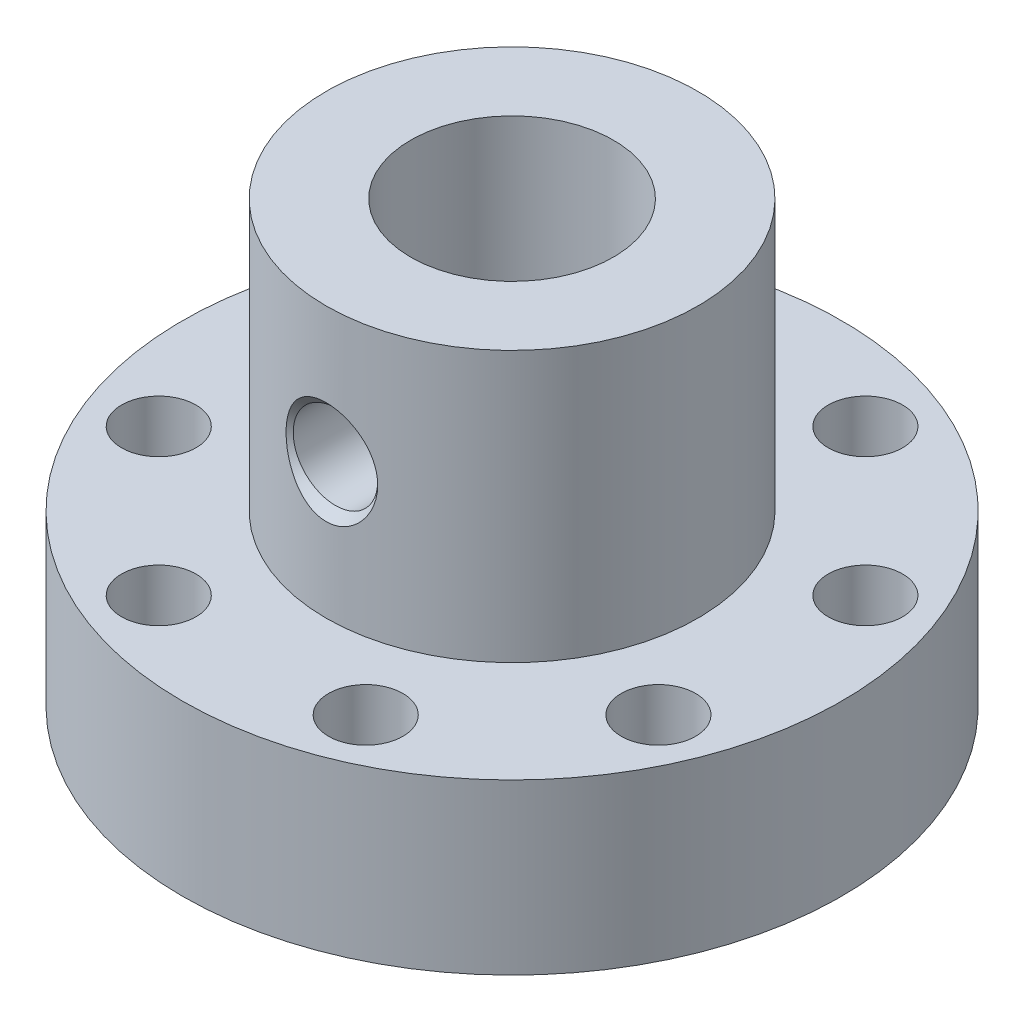
ISO-10303-21;
HEADER;
FILE_DESCRIPTION(('STEP AP214'),'2;1');
FILE_NAME('part.step','',(''),(''),'','','');
FILE_SCHEMA(('AUTOMOTIVE_DESIGN { 1 0 10303 214 1 1 1 1 }'));
ENDSEC;
DATA;
#1=APPLICATION_CONTEXT('core data for automotive mechanical design processes');
#2=APPLICATION_PROTOCOL_DEFINITION('international standard','automotive_design',2000,#1);
#3=PRODUCT_CONTEXT('',#1,'mechanical');
#4=PRODUCT('Part','Part','',(#3));
#5=PRODUCT_RELATED_PRODUCT_CATEGORY('part','',(#4));
#6=PRODUCT_DEFINITION_FORMATION('','',#4);
#7=PRODUCT_DEFINITION_CONTEXT('part definition',#1,'design');
#8=PRODUCT_DEFINITION('design','',#6,#7);
#9=PRODUCT_DEFINITION_SHAPE('','',#8);
#10=(LENGTH_UNIT() NAMED_UNIT(*) SI_UNIT(.MILLI.,.METRE.));
#11=(NAMED_UNIT(*) PLANE_ANGLE_UNIT() SI_UNIT($,.RADIAN.));
#12=(NAMED_UNIT(*) SI_UNIT($,.STERADIAN.) SOLID_ANGLE_UNIT());
#13=UNCERTAINTY_MEASURE_WITH_UNIT(LENGTH_MEASURE(1.E-05),#10,'distance_accuracy_value','');
#14=(GEOMETRIC_REPRESENTATION_CONTEXT(3) GLOBAL_UNCERTAINTY_ASSIGNED_CONTEXT((#13)) GLOBAL_UNIT_ASSIGNED_CONTEXT((#10,
#11,#12)) REPRESENTATION_CONTEXT('',''));
#15=CARTESIAN_POINT('',(0.,0.,0.));
#16=DIRECTION('',(0.,0.,1.));
#17=DIRECTION('',(1.,0.,0.));
#18=AXIS2_PLACEMENT_3D('',#15,#16,#17);
#19=CARTESIAN_POINT('',(0.,0.,0.));
#20=DIRECTION('',(0.,1.,0.));
#21=DIRECTION('',(0.,0.,1.));
#22=AXIS2_PLACEMENT_3D('',#19,#20,#21);
#23=PLANE('',#22);
#24=CARTESIAN_POINT('',(-3.06146745892072,0.,7.39103626009029));
#25=DIRECTION('',(0.,1.,0.));
#26=DIRECTION('',(0.,0.,1.));
#27=AXIS2_PLACEMENT_3D('',#24,#25,#26);
#28=CIRCLE('',#27,1.1);
#29=CARTESIAN_POINT('',(-3.06146745892072,0.,8.4910362600903));
#30=VERTEX_POINT('',#29);
#31=EDGE_CURVE('E250',#30,#30,#28,.T.);
#32=ORIENTED_EDGE('',*,*,#31,.T.);
#33=EDGE_LOOP('',(#32));
#34=FACE_BOUND('',#33,.T.);
#35=CARTESIAN_POINT('',(3.06146745892072,0.,-7.39103626009029));
#36=DIRECTION('',(0.,1.,0.));
#37=DIRECTION('',(0.,0.,1.));
#38=AXIS2_PLACEMENT_3D('',#35,#36,#37);
#39=CIRCLE('',#38,1.1);
#40=CARTESIAN_POINT('',(3.06146745892072,0.,-6.29103626009029));
#41=VERTEX_POINT('',#40);
#42=EDGE_CURVE('E255',#41,#41,#39,.T.);
#43=ORIENTED_EDGE('',*,*,#42,.T.);
#44=EDGE_LOOP('',(#43));
#45=FACE_BOUND('',#44,.T.);
#46=CARTESIAN_POINT('',(3.06146745892072,0.,7.39103626009029));
#47=DIRECTION('',(0.,1.,0.));
#48=DIRECTION('',(0.,0.,1.));
#49=AXIS2_PLACEMENT_3D('',#46,#47,#48);
#50=CIRCLE('',#49,1.1);
#51=CARTESIAN_POINT('',(3.06146745892072,0.,8.4910362600903));
#52=VERTEX_POINT('',#51);
#53=EDGE_CURVE('E241',#52,#52,#50,.T.);
#54=ORIENTED_EDGE('',*,*,#53,.T.);
#55=EDGE_LOOP('',(#54));
#56=FACE_BOUND('',#55,.T.);
#57=CARTESIAN_POINT('',(7.39103626009029,0.,3.06146745892072));
#58=DIRECTION('',(0.,1.,0.));
#59=DIRECTION('',(0.,0.,1.));
#60=AXIS2_PLACEMENT_3D('',#57,#58,#59);
#61=CIRCLE('',#60,1.1);
#62=CARTESIAN_POINT('',(7.39103626009029,0.,4.16146745892072));
#63=VERTEX_POINT('',#62);
#64=EDGE_CURVE('E238',#63,#63,#61,.T.);
#65=ORIENTED_EDGE('',*,*,#64,.T.);
#66=EDGE_LOOP('',(#65));
#67=FACE_BOUND('',#66,.T.);
#68=CARTESIAN_POINT('',(-7.39103626009029,0.,3.06146745892072));
#69=DIRECTION('',(0.,1.,0.));
#70=DIRECTION('',(0.,0.,1.));
#71=AXIS2_PLACEMENT_3D('',#68,#69,#70);
#72=CIRCLE('',#71,1.1);
#73=CARTESIAN_POINT('',(-7.39103626009029,0.,4.16146745892072));
#74=VERTEX_POINT('',#73);
#75=EDGE_CURVE('E273',#74,#74,#72,.T.);
#76=ORIENTED_EDGE('',*,*,#75,.T.);
#77=EDGE_LOOP('',(#76));
#78=FACE_BOUND('',#77,.T.);
#79=CARTESIAN_POINT('',(-7.3910362600903,0.,-3.06146745892072));
#80=DIRECTION('',(0.,1.,0.));
#81=DIRECTION('',(0.,0.,1.));
#82=AXIS2_PLACEMENT_3D('',#79,#80,#81);
#83=CIRCLE('',#82,1.1);
#84=CARTESIAN_POINT('',(-7.3910362600903,0.,-1.96146745892072));
#85=VERTEX_POINT('',#84);
#86=EDGE_CURVE('E267',#85,#85,#83,.T.);
#87=ORIENTED_EDGE('',*,*,#86,.T.);
#88=EDGE_LOOP('',(#87));
#89=FACE_BOUND('',#88,.T.);
#90=CARTESIAN_POINT('',(-3.06146745892072,0.,-7.39103626009029));
#91=DIRECTION('',(0.,1.,0.));
#92=DIRECTION('',(0.,0.,1.));
#93=AXIS2_PLACEMENT_3D('',#90,#91,#92);
#94=CIRCLE('',#93,1.1);
#95=CARTESIAN_POINT('',(-3.06146745892072,0.,-6.2910362600903));
#96=VERTEX_POINT('',#95);
#97=EDGE_CURVE('E261',#96,#96,#94,.T.);
#98=ORIENTED_EDGE('',*,*,#97,.T.);
#99=EDGE_LOOP('',(#98));
#100=FACE_BOUND('',#99,.T.);
#101=CARTESIAN_POINT('',(7.3910362600903,0.,-3.06146745892072));
#102=DIRECTION('',(0.,1.,0.));
#103=DIRECTION('',(0.,0.,1.));
#104=AXIS2_PLACEMENT_3D('',#101,#102,#103);
#105=CIRCLE('',#104,1.1);
#106=CARTESIAN_POINT('',(7.3910362600903,0.,-1.96146745892072));
#107=VERTEX_POINT('',#106);
#108=EDGE_CURVE('E233',#107,#107,#105,.T.);
#109=ORIENTED_EDGE('',*,*,#108,.T.);
#110=EDGE_LOOP('',(#109));
#111=FACE_BOUND('',#110,.T.);
#112=CARTESIAN_POINT('',(0.,0.,0.));
#113=DIRECTION('',(0.,1.,0.));
#114=DIRECTION('',(0.,0.,1.));
#115=AXIS2_PLACEMENT_3D('',#112,#113,#114);
#116=CIRCLE('',#115,9.75);
#117=CARTESIAN_POINT('',(0.,0.,9.75));
#118=VERTEX_POINT('',#117);
#119=EDGE_CURVE('E58',#118,#118,#116,.T.);
#120=ORIENTED_EDGE('',*,*,#119,.F.);
#121=EDGE_LOOP('',(#120));
#122=FACE_BOUND('',#121,.T.);
#123=CARTESIAN_POINT('',(0.,0.,0.));
#124=DIRECTION('',(0.,1.,0.));
#125=DIRECTION('',(0.,0.,1.));
#126=AXIS2_PLACEMENT_3D('',#123,#124,#125);
#127=CIRCLE('',#126,4.);
#128=CARTESIAN_POINT('',(0.,0.,4.));
#129=VERTEX_POINT('',#128);
#130=EDGE_CURVE('E63',#129,#129,#127,.T.);
#131=ORIENTED_EDGE('',*,*,#130,.T.);
#132=EDGE_LOOP('',(#131));
#133=FACE_BOUND('',#132,.T.);
#134=ADVANCED_FACE('F45',(#34,#45,#56,#67,#78,#89,#100,#111,#122,#133),#23,.F.);
#135=CARTESIAN_POINT('',(0.,3.,0.));
#136=DIRECTION('',(0.,-1.,0.));
#137=DIRECTION('',(0.,0.,-1.));
#138=AXIS2_PLACEMENT_3D('',#135,#136,#137);
#139=CYLINDRICAL_SURFACE('',#138,9.75);
#140=ORIENTED_EDGE('',*,*,#119,.T.);
#141=EDGE_LOOP('',(#140));
#142=FACE_BOUND('',#141,.T.);
#143=CARTESIAN_POINT('',(0.,5.,0.));
#144=DIRECTION('',(0.,1.,0.));
#145=DIRECTION('',(0.,0.,1.));
#146=AXIS2_PLACEMENT_3D('',#143,#144,#145);
#147=CIRCLE('',#146,9.75);
#148=CARTESIAN_POINT('',(0.,5.,9.75));
#149=VERTEX_POINT('',#148);
#150=EDGE_CURVE('E83',#149,#149,#147,.T.);
#151=ORIENTED_EDGE('',*,*,#150,.F.);
#152=EDGE_LOOP('',(#151));
#153=FACE_BOUND('',#152,.T.);
#154=ADVANCED_FACE('F47',(#142,#153),#139,.T.);
#155=CARTESIAN_POINT('',(0.,3.,0.));
#156=DIRECTION('',(0.,-1.,0.));
#157=DIRECTION('',(0.,0.,-1.));
#158=AXIS2_PLACEMENT_3D('',#155,#156,#157);
#159=CYLINDRICAL_SURFACE('',#158,4.);
#160=CARTESIAN_POINT('',(0.,3.,0.));
#161=DIRECTION('',(0.,1.,0.));
#162=DIRECTION('',(0.,0.,1.));
#163=AXIS2_PLACEMENT_3D('',#160,#161,#162);
#164=CIRCLE('',#163,4.);
#165=CARTESIAN_POINT('',(0.,3.,4.));
#166=VERTEX_POINT('',#165);
#167=EDGE_CURVE('E68',#166,#166,#164,.T.);
#168=ORIENTED_EDGE('',*,*,#167,.T.);
#169=EDGE_LOOP('',(#168));
#170=FACE_BOUND('',#169,.T.);
#171=ORIENTED_EDGE('',*,*,#130,.F.);
#172=EDGE_LOOP('',(#171));
#173=FACE_BOUND('',#172,.T.);
#174=ADVANCED_FACE('F157',(#170,#173),#159,.F.);
#175=CARTESIAN_POINT('',(0.,3.,0.));
#176=DIRECTION('',(0.,1.,0.));
#177=DIRECTION('',(0.,0.,1.));
#178=AXIS2_PLACEMENT_3D('',#175,#176,#177);
#179=PLANE('',#178);
#180=CARTESIAN_POINT('',(0.,3.,0.));
#181=DIRECTION('',(0.,1.,0.));
#182=DIRECTION('',(0.,0.,1.));
#183=AXIS2_PLACEMENT_3D('',#180,#181,#182);
#184=CIRCLE('',#183,3.);
#185=CARTESIAN_POINT('',(0.,3.,3.));
#186=VERTEX_POINT('',#185);
#187=EDGE_CURVE('E79',#186,#186,#184,.T.);
#188=ORIENTED_EDGE('',*,*,#187,.T.);
#189=EDGE_LOOP('',(#188));
#190=FACE_BOUND('',#189,.T.);
#191=ORIENTED_EDGE('',*,*,#167,.F.);
#192=EDGE_LOOP('',(#191));
#193=FACE_BOUND('',#192,.T.);
#194=ADVANCED_FACE('F162',(#190,#193),#179,.F.);
#195=CARTESIAN_POINT('',(0.,13.,0.));
#196=DIRECTION('',(0.,1.,0.));
#197=DIRECTION('',(0.,0.,1.));
#198=AXIS2_PLACEMENT_3D('',#195,#196,#197);
#199=PLANE('',#198);
#200=CARTESIAN_POINT('',(0.,13.,0.));
#201=DIRECTION('',(0.,1.,0.));
#202=DIRECTION('',(0.,0.,1.));
#203=AXIS2_PLACEMENT_3D('',#200,#201,#202);
#204=CIRCLE('',#203,5.5);
#205=CARTESIAN_POINT('',(0.,13.,5.5));
#206=VERTEX_POINT('',#205);
#207=EDGE_CURVE('E74',#206,#206,#204,.T.);
#208=ORIENTED_EDGE('',*,*,#207,.T.);
#209=EDGE_LOOP('',(#208));
#210=FACE_BOUND('',#209,.T.);
#211=CARTESIAN_POINT('',(0.,13.,0.));
#212=DIRECTION('',(0.,1.,0.));
#213=DIRECTION('',(0.,0.,1.));
#214=AXIS2_PLACEMENT_3D('',#211,#212,#213);
#215=CIRCLE('',#214,3.);
#216=CARTESIAN_POINT('',(0.,13.,3.));
#217=VERTEX_POINT('',#216);
#218=EDGE_CURVE('E78',#217,#217,#215,.T.);
#219=ORIENTED_EDGE('',*,*,#218,.F.);
#220=EDGE_LOOP('',(#219));
#221=FACE_BOUND('',#220,.T.);
#222=ADVANCED_FACE('F169',(#210,#221),#199,.T.);
#223=CARTESIAN_POINT('',(0.,13.,0.));
#224=DIRECTION('',(0.,-1.,0.));
#225=DIRECTION('',(0.,0.,-1.));
#226=AXIS2_PLACEMENT_3D('',#223,#224,#225);
#227=CYLINDRICAL_SURFACE('',#226,5.5);
#228=CARTESIAN_POINT('',(-1.00052387250347,7.97379325918105,5.4082300266272));
#229=CARTESIAN_POINT('',(-1.0554657484319,8.04156020867493,5.39806643581845));
#230=CARTESIAN_POINT('',(-1.1045014651177,8.11424081843968,5.38813270733572));
#231=CARTESIAN_POINT('',(-1.18996020741901,8.26695102943327,5.36990827115365));
#232=CARTESIAN_POINT('',(-1.2263598361351,8.34699391976481,5.36162062333372));
#233=CARTESIAN_POINT('',(-1.28608303890986,8.51239784311969,5.34761048061609));
#234=CARTESIAN_POINT('',(-1.30935337017347,8.59777899260584,5.3418984490507));
#235=CARTESIAN_POINT('',(-1.34223444541689,8.77123564680758,5.33373183939765));
#236=CARTESIAN_POINT('',(-1.35185062164581,8.85931006576263,5.33127596588675));
#237=CARTESIAN_POINT('',(-1.35741098529404,9.03972134578171,5.32986383876357));
#238=CARTESIAN_POINT('',(-1.35274981382376,9.13207871461217,5.33106252860062));
#239=CARTESIAN_POINT('',(-1.32849883860555,9.31471262912647,5.33715689571876));
#240=CARTESIAN_POINT('',(-1.30890495092525,9.40498859861099,5.34205358435821));
#241=CARTESIAN_POINT('',(-1.25501903213701,9.58112873656562,5.35496907595434));
#242=CARTESIAN_POINT('',(-1.22068161477344,9.66697835738474,5.36299751259465));
#243=CARTESIAN_POINT('',(-1.13781655690637,9.83133726430906,5.38118632671762));
#244=CARTESIAN_POINT('',(-1.08928740944958,9.90984576972665,5.39134693057275));
#245=CARTESIAN_POINT('',(-0.980489652373554,10.0544866645563,5.41217222671285));
#246=CARTESIAN_POINT('',(-0.920620141356508,10.1209213691306,5.42281240530795));
#247=CARTESIAN_POINT('',(-0.789370575322671,10.2414061875109,5.44346256731009));
#248=CARTESIAN_POINT('',(-0.717999247397745,10.295465616465,5.4534730205819));
#249=CARTESIAN_POINT('',(-0.573169983321123,10.3836027731631,5.47048875989742));
#250=CARTESIAN_POINT('',(-0.500621866522178,10.4191309843887,5.47769367987768));
#251=CARTESIAN_POINT('',(-0.349860125187441,10.4755895964628,5.4893788771205));
#252=CARTESIAN_POINT('',(-0.271653706235754,10.4965382147268,5.49386255371661));
#253=CARTESIAN_POINT('',(-0.123030073411433,10.5206969946859,5.49905929613035));
#254=CARTESIAN_POINT('',(-0.0529439875198124,10.5258804217424,5.50019128043391));
#255=CARTESIAN_POINT('',(0.0870327866744314,10.5238762500614,5.49975589939685));
#256=CARTESIAN_POINT('',(0.156923532154605,10.5166927604855,5.49818943067248));
#257=CARTESIAN_POINT('',(0.290205358137622,10.4911673798636,5.49272003532195));
#258=CARTESIAN_POINT('',(0.353736224043138,10.4735115988784,5.48896099191541));
#259=CARTESIAN_POINT('',(0.477093442768947,10.4284774363022,5.47961786163847));
#260=CARTESIAN_POINT('',(0.536919251941039,10.4010976318424,5.4740335076888));
#261=CARTESIAN_POINT('',(0.65462824024958,10.3360703900254,5.46124079246233));
#262=CARTESIAN_POINT('',(0.712248614428371,10.2979630532927,5.45396308044335));
#263=CARTESIAN_POINT('',(0.821050666064558,10.2136017836456,5.4386487882479));
#264=CARTESIAN_POINT('',(0.872229634772367,10.1673444429721,5.43061189128821));
#265=CARTESIAN_POINT('',(0.973051698791193,10.0622158091885,5.41350953584637));
#266=CARTESIAN_POINT('',(1.02181411795321,10.0025018487577,5.4044337773503));
#267=CARTESIAN_POINT('',(1.10983943560949,9.87634487882156,5.38704680369644));
#268=CARTESIAN_POINT('',(1.14909775295255,9.80989864603979,5.37873595843237));
#269=CARTESIAN_POINT('',(1.22155471937881,9.66407741926922,5.36277343900032));
#270=CARTESIAN_POINT('',(1.25356506927691,9.58409024566075,5.35530275765835));
#271=CARTESIAN_POINT('',(1.30482448845177,9.41993056581359,5.34304491257989));
#272=CARTESIAN_POINT('',(1.32406988129983,9.33575686131136,5.33825852200585));
#273=CARTESIAN_POINT('',(1.35028144340634,9.16022919296314,5.33169210788218));
#274=CARTESIAN_POINT('',(1.3564446056767,9.06874683579866,5.33010895369968));
#275=CARTESIAN_POINT('',(1.35401315834569,8.88598582933959,5.33072678850904));
#276=CARTESIAN_POINT('',(1.34541655252507,8.79470720927174,5.33292828936544));
#277=CARTESIAN_POINT('',(1.31339680376502,8.61370227048302,5.34090474063982));
#278=CARTESIAN_POINT('',(1.28978092857434,8.52401194579916,5.34672612060254));
#279=CARTESIAN_POINT('',(1.22791548430496,8.35004244328568,5.36127111384655));
#280=CARTESIAN_POINT('',(1.18966337472602,8.26576420783285,5.36999523093927));
#281=CARTESIAN_POINT('',(1.09976125885337,8.10645869588397,5.38911883260409));
#282=CARTESIAN_POINT('',(1.04830950679207,8.03131691193044,5.39949272919581));
#283=CARTESIAN_POINT('',(0.932575076160755,7.8916715976647,5.42067807714297));
#284=CARTESIAN_POINT('',(0.868296381469706,7.82716477560563,5.43148939181302));
#285=CARTESIAN_POINT('',(0.73329404616714,7.71597594586229,5.45129219564575));
#286=CARTESIAN_POINT('',(0.663366449668579,7.66834561480742,5.460358646005));
#287=CARTESIAN_POINT('',(0.515417583352195,7.58746255033908,5.47629844373561));
#288=CARTESIAN_POINT('',(0.437407018724636,7.55419109418913,5.48317464391969));
#289=CARTESIAN_POINT('',(0.286627639805638,7.50753014379122,5.49297605739365));
#290=CARTESIAN_POINT('',(0.214513334910019,7.49210529416873,5.49630119205496));
#291=CARTESIAN_POINT('',(0.0686188928834042,7.47472499250544,5.50005439358101));
#292=CARTESIAN_POINT('',(-0.0051600322403689,7.47276003887008,5.5004845040942));
#293=CARTESIAN_POINT('',(-0.144682479857096,7.48193474574112,5.49849699148874));
#294=CARTESIAN_POINT('',(-0.210515981326962,7.49183142277474,5.49634944944287));
#295=CARTESIAN_POINT('',(-0.339591469018007,7.52218282103491,5.48988656631123));
#296=CARTESIAN_POINT('',(-0.402832920413141,7.54263970946405,5.48557078025591));
#297=CARTESIAN_POINT('',(-0.52601582663867,7.59351028529871,5.4751427424527));
#298=CARTESIAN_POINT('',(-0.58589936977261,7.62405809079117,5.46900641242686));
#299=CARTESIAN_POINT('',(-0.700198257281998,7.69378900247445,5.45555091930076));
#300=CARTESIAN_POINT('',(-0.754616244718938,7.73296790523659,5.44823233243229));
#301=CARTESIAN_POINT('',(-0.841468930072948,7.80554181839295,5.43536819832995));
#302=CARTESIAN_POINT('',(-0.875536119031958,7.8370398917072,5.42996512426176));
#303=CARTESIAN_POINT('',(-0.940466053555692,7.90316058800971,5.41909640710834));
#304=CARTESIAN_POINT('',(-0.971328811185103,7.93778319923316,5.41363076425877));
#305=CARTESIAN_POINT('',(-1.00052387250347,7.97379325918105,5.4082300266272));
#306=B_SPLINE_CURVE_WITH_KNOTS('',3,(#228,#229,#230,#231,#232,#233,#234,#235,#236,#237,#238,
#239,#240,#241,#242,#243,#244,#245,#246,#247,#248,#249,#250,#251,#252,#253,#254,#255,#256,#257,
#258,#259,#260,#261,#262,#263,#264,#265,#266,#267,#268,#269,#270,#271,#272,#273,#274,#275,#276,
#277,#278,#279,#280,#281,#282,#283,#284,#285,#286,#287,#288,#289,#290,#291,#292,#293,#294,#295,
#296,#297,#298,#299,#300,#301,#302,#303,#304,#305),.UNSPECIFIED.,.T.,.F.,(4,2,2,2,2,2,2,2,2,2,2,
2,2,2,2,2,2,2,2,2,2,2,2,2,2,2,2,2,2,2,2,2,2,2,2,2,2,2,4),(0.,0.263319284252195,
0.527123560350399,0.79199008234411,1.05675119873404,1.33289125552464,1.60910686067373,
1.88617892953236,2.16328043006469,2.43200767982708,2.70053198251204,2.94241060529711,
3.18398645193502,3.39373762400117,3.60341911538941,3.80068122661228,3.9979722141382,
4.20552279715343,4.41316037009143,4.64509753251513,4.87714627129247,5.13545173677483,
5.39383156441459,5.66766050550402,5.94152648414467,6.21897972970212,6.49648115637056,
6.77003648893484,7.04350699069406,7.29730874579044,7.55077855796828,7.77100317182985,
7.99107230894558,8.18996207740549,8.38889267893811,8.59058144616458,8.79217220528277,
8.9320955600136,9.07201838791383),.UNSPECIFIED.);
#307=CARTESIAN_POINT('',(-1.00052387250347,7.97379325918105,5.4082300266272));
#308=VERTEX_POINT('',#307);
#309=EDGE_CURVE('E10',#308,#308,#306,.T.);
#310=ORIENTED_EDGE('',*,*,#309,.T.);
#311=EDGE_LOOP('',(#310));
#312=FACE_BOUND('',#311,.T.);
#313=CARTESIAN_POINT('',(0.,5.,0.));
#314=DIRECTION('',(0.,1.,0.));
#315=DIRECTION('',(0.,0.,1.));
#316=AXIS2_PLACEMENT_3D('',#313,#314,#315);
#317=CIRCLE('',#316,5.5);
#318=CARTESIAN_POINT('',(0.,5.,5.5));
#319=VERTEX_POINT('',#318);
#320=EDGE_CURVE('E90',#319,#319,#317,.T.);
#321=ORIENTED_EDGE('',*,*,#320,.T.);
#322=EDGE_LOOP('',(#321));
#323=FACE_BOUND('',#322,.T.);
#324=ORIENTED_EDGE('',*,*,#207,.F.);
#325=EDGE_LOOP('',(#324));
#326=FACE_BOUND('',#325,.T.);
#327=ADVANCED_FACE('F164',(#312,#323,#326),#227,.T.);
#328=CARTESIAN_POINT('',(0.,13.,0.));
#329=DIRECTION('',(0.,-1.,0.));
#330=DIRECTION('',(0.,0.,-1.));
#331=AXIS2_PLACEMENT_3D('',#328,#329,#330);
#332=CYLINDRICAL_SURFACE('',#331,3.);
#333=CARTESIAN_POINT('',(1.25,9.,2.72717802865893));
#334=CARTESIAN_POINT('',(1.24999259066567,8.93332810910315,2.72718519563219));
#335=CARTESIAN_POINT('',(1.24463203881503,8.86654734317379,2.729658595344));
#336=CARTESIAN_POINT('',(1.22339678947785,8.73491305794286,2.73923833650884));
#337=CARTESIAN_POINT('',(1.20749354003276,8.67006527332476,2.74635725824267));
#338=CARTESIAN_POINT('',(1.16589988419451,8.54443887030893,2.76426917574768));
#339=CARTESIAN_POINT('',(1.14024937431428,8.48364483628498,2.77504717562616));
#340=CARTESIAN_POINT('',(1.08000637754463,8.36724055042195,2.79904148565793));
#341=CARTESIAN_POINT('',(1.04541600591531,8.31162907656688,2.81225721880783));
#342=CARTESIAN_POINT('',(0.965973882676166,8.20367427502653,2.84055762619857));
#343=CARTESIAN_POINT('',(0.920653238184409,8.15169244125591,2.85570568079146));
#344=CARTESIAN_POINT('',(0.82202167574555,8.05579977750245,2.88564295372227));
#345=CARTESIAN_POINT('',(0.768707691374005,8.01189205938699,2.90043203180789));
#346=CARTESIAN_POINT('',(0.652763393797348,7.93155046912072,2.92875537930613));
#347=CARTESIAN_POINT('',(0.589829293683659,7.89552337196765,2.94220739975291));
#348=CARTESIAN_POINT('',(0.458132022362353,7.8347239794944,2.96556519993426));
#349=CARTESIAN_POINT('',(0.389371454872124,7.80994668803578,2.97547255347157));
#350=CARTESIAN_POINT('',(0.251768498025166,7.77366054124326,2.99017521042367));
#351=CARTESIAN_POINT('',(0.183116576196081,7.76152830509796,2.99520971127466));
#352=CARTESIAN_POINT('',(0.0445791803650061,7.74886235884014,3.00046828611204));
#353=CARTESIAN_POINT('',(-0.0253057817645164,7.74832394411704,3.00069431131015));
#354=CARTESIAN_POINT('',(-0.159792780112568,7.75853428093332,2.99645129133057));
#355=CARTESIAN_POINT('',(-0.224457488607314,7.76859810052573,2.99226714648664));
#356=CARTESIAN_POINT('',(-0.351082893931456,7.79855310263816,2.98006516750309));
#357=CARTESIAN_POINT('',(-0.413043391054916,7.81844500963016,2.97204705074577));
#358=CARTESIAN_POINT('',(-0.533638118077525,7.86772804089464,2.95279852414029));
#359=CARTESIAN_POINT('',(-0.592207177074906,7.89725946287083,2.94152097126085));
#360=CARTESIAN_POINT('',(-0.703711767281963,7.96484575670034,2.91685713989805));
#361=CARTESIAN_POINT('',(-0.756645297756974,8.00290364084499,2.90347011666255));
#362=CARTESIAN_POINT('',(-0.859340911707923,8.08958242040462,2.87481698777061));
#363=CARTESIAN_POINT('',(-0.908616437316239,8.13875879127901,2.8594849435601));
#364=CARTESIAN_POINT('',(-0.998431414927667,8.24471144070658,2.8293786068147));
#365=CARTESIAN_POINT('',(-1.03896749582431,8.30149063829209,2.8146045313137));
#366=CARTESIAN_POINT('',(-1.11140189250063,8.42339503666191,2.78681612355338));
#367=CARTESIAN_POINT('',(-1.1429725335554,8.48873320574328,2.77387558556714));
#368=CARTESIAN_POINT('',(-1.19446432058392,8.6244810449745,2.75209844221011));
#369=CARTESIAN_POINT('',(-1.21439379627313,8.69488704826955,2.74325890334594));
#370=CARTESIAN_POINT('',(-1.24080025168121,8.833896808914,2.73141212519724));
#371=CARTESIAN_POINT('',(-1.24806614632866,8.90232112225905,2.72806369197117));
#372=CARTESIAN_POINT('',(-1.25125630518999,9.0394784824115,2.72660286810642));
#373=CARTESIAN_POINT('',(-1.24718449318149,9.10821141419171,2.72848866599319));
#374=CARTESIAN_POINT('',(-1.22853477565556,9.23939838543045,2.73693131345749));
#375=CARTESIAN_POINT('',(-1.21464618818048,9.3019726867868,2.74318138016618));
#376=CARTESIAN_POINT('',(-1.17767058564225,9.42385129649787,2.75925630297447));
#377=CARTESIAN_POINT('',(-1.15458142053125,9.48315483683071,2.76908199460161));
#378=CARTESIAN_POINT('',(-1.09877520805186,9.59961531035647,2.79170797857));
#379=CARTESIAN_POINT('',(-1.06569183306198,9.65657497461032,2.80461662202282));
#380=CARTESIAN_POINT('',(-0.99120078438597,9.76440805249902,2.83180003740794));
#381=CARTESIAN_POINT('',(-0.949789507875988,9.81527881670187,2.84607539920583));
#382=CARTESIAN_POINT('',(-0.855844455715506,9.913800134884,2.87578619784533));
#383=CARTESIAN_POINT('',(-0.802679661479739,9.96085139995066,2.89122146708842));
#384=CARTESIAN_POINT('',(-0.688851512553539,10.0454722919793,2.92043361183923));
#385=CARTESIAN_POINT('',(-0.628187608803656,10.0830412240637,2.93421036577014));
#386=CARTESIAN_POINT('',(-0.500654680803384,10.1475898754436,2.9586425158565));
#387=CARTESIAN_POINT('',(-0.433770169638507,10.1745422412895,2.96928983138826));
#388=CARTESIAN_POINT('',(-0.295858835154417,10.2166167923344,2.98618173103366));
#389=CARTESIAN_POINT('',(-0.224834504225196,10.2317460182261,2.9924289351992));
#390=CARTESIAN_POINT('',(-0.0860165335064122,10.2488581255203,2.9995153479751));
#391=CARTESIAN_POINT('',(-0.0183440847938991,10.251685999697,3.00070204534225));
#392=CARTESIAN_POINT('',(0.116486811714284,10.2463868587061,2.99849523480953));
#393=CARTESIAN_POINT('',(0.183645347541154,10.2382617639871,2.99510252984313));
#394=CARTESIAN_POINT('',(0.313086482449184,10.2118939278413,2.98430065981735));
#395=CARTESIAN_POINT('',(0.375457537843568,10.1940203195304,2.97703824209234));
#396=CARTESIAN_POINT('',(0.49629223050133,10.1490657527909,2.95929499847058));
#397=CARTESIAN_POINT('',(0.554755122985826,10.1219830453351,2.94881356124207));
#398=CARTESIAN_POINT('',(0.669024565478781,10.0580104707855,2.92505825398663));
#399=CARTESIAN_POINT('',(0.724591657976681,10.020732698576,2.91167959188766));
#400=CARTESIAN_POINT('',(0.828918675638781,9.93799281712811,2.88371561874231));
#401=CARTESIAN_POINT('',(0.877676061786042,9.89252766959325,2.86912986083797));
#402=CARTESIAN_POINT('',(0.97044978723158,9.7910551741456,2.83914845259141));
#403=CARTESIAN_POINT('',(1.01391775364847,9.73454098537888,2.82376522857896));
#404=CARTESIAN_POINT('',(1.09083332306674,9.61454125931981,2.79495552690186));
#405=CARTESIAN_POINT('',(1.12427532456755,9.55105185194186,2.78153014522558));
#406=CARTESIAN_POINT('',(1.17982766043577,9.41905616497725,2.75842557732642));
#407=CARTESIAN_POINT('',(1.20199823632854,9.35057884120679,2.74872654469865));
#408=CARTESIAN_POINT('',(1.23423556453801,9.21046042614933,2.73440803066668));
#409=CARTESIAN_POINT('',(1.2443429152121,9.1388307927257,2.72977151604981));
#410=CARTESIAN_POINT('',(1.2494046492365,9.04464147573811,2.72744979732688));
#411=CARTESIAN_POINT('',(1.25000248121118,9.02232684261197,2.72717562860875));
#412=CARTESIAN_POINT('',(1.25,9.,2.72717802865893));
#413=B_SPLINE_CURVE_WITH_KNOTS('',3,(#333,#334,#335,#336,#337,#338,#339,#340,#341,#342,#343,
#344,#345,#346,#347,#348,#349,#350,#351,#352,#353,#354,#355,#356,#357,#358,#359,#360,#361,#362,
#363,#364,#365,#366,#367,#368,#369,#370,#371,#372,#373,#374,#375,#376,#377,#378,#379,#380,#381,
#382,#383,#384,#385,#386,#387,#388,#389,#390,#391,#392,#393,#394,#395,#396,#397,#398,#399,#400,
#401,#402,#403,#404,#405,#406,#407,#408,#409,#410,#411,#412),.UNSPECIFIED.,.T.,.F.,(4,2,2,2,2,2,
2,2,2,2,2,2,2,2,2,2,2,2,2,2,2,2,2,2,2,2,2,2,2,2,2,2,2,2,2,2,2,2,2,4),(0.,0.199951711985515,
0.400447161842176,0.600130652152113,0.799766938550099,1.01066841430654,1.22165100459911,
1.44178476577924,1.66182066774891,1.87040605977952,2.0789068091793,2.27471840245093,
2.47054443201884,2.66935814640066,2.86824221022484,3.08114531844484,3.29413040441366,
3.51411545666722,3.73394290745569,3.93950778306308,4.14500152518448,4.33733901066192,
4.5297214691353,4.73025126818169,4.93086800795465,5.14781662735514,5.36478114041866,
5.58230105955595,5.79969134643007,6.00188635094053,6.20404590801914,6.39903415036488,
6.59405944632173,6.79789862829037,7.00181361048904,7.21960426908077,7.43751638139189,
7.65425125796865,7.87025464546163,7.93721375436706),.UNSPECIFIED.);
#414=CARTESIAN_POINT('',(1.25,9.,2.72717802865893));
#415=VERTEX_POINT('',#414);
#416=EDGE_CURVE('E94',#415,#415,#413,.T.);
#417=ORIENTED_EDGE('',*,*,#416,.F.);
#418=EDGE_LOOP('',(#417));
#419=FACE_BOUND('',#418,.T.);
#420=ORIENTED_EDGE('',*,*,#218,.T.);
#421=EDGE_LOOP('',(#420));
#422=FACE_BOUND('',#421,.T.);
#423=ORIENTED_EDGE('',*,*,#187,.F.);
#424=EDGE_LOOP('',(#423));
#425=FACE_BOUND('',#424,.T.);
#426=ADVANCED_FACE('F168',(#419,#422,#425),#332,.F.);
#427=CARTESIAN_POINT('',(0.,5.,0.));
#428=DIRECTION('',(0.,1.,0.));
#429=DIRECTION('',(0.,0.,1.));
#430=AXIS2_PLACEMENT_3D('',#427,#428,#429);
#431=PLANE('',#430);
#432=CARTESIAN_POINT('',(-3.06146745892072,5.,7.39103626009029));
#433=DIRECTION('',(0.,1.,0.));
#434=DIRECTION('',(0.,0.,1.));
#435=AXIS2_PLACEMENT_3D('',#432,#433,#434);
#436=CIRCLE('',#435,1.1);
#437=CARTESIAN_POINT('',(-3.06146745892072,5.,8.4910362600903));
#438=VERTEX_POINT('',#437);
#439=EDGE_CURVE('E185',#438,#438,#436,.T.);
#440=ORIENTED_EDGE('',*,*,#439,.F.);
#441=EDGE_LOOP('',(#440));
#442=FACE_BOUND('',#441,.T.);
#443=CARTESIAN_POINT('',(3.06146745892072,5.,-7.39103626009029));
#444=DIRECTION('',(0.,1.,0.));
#445=DIRECTION('',(0.,0.,1.));
#446=AXIS2_PLACEMENT_3D('',#443,#444,#445);
#447=CIRCLE('',#446,1.1);
#448=CARTESIAN_POINT('',(3.06146745892072,5.,-6.29103626009029));
#449=VERTEX_POINT('',#448);
#450=EDGE_CURVE('E189',#449,#449,#447,.T.);
#451=ORIENTED_EDGE('',*,*,#450,.F.);
#452=EDGE_LOOP('',(#451));
#453=FACE_BOUND('',#452,.T.);
#454=CARTESIAN_POINT('',(3.06146745892072,5.,7.39103626009029));
#455=DIRECTION('',(0.,1.,0.));
#456=DIRECTION('',(0.,0.,1.));
#457=AXIS2_PLACEMENT_3D('',#454,#455,#456);
#458=CIRCLE('',#457,1.1);
#459=CARTESIAN_POINT('',(3.06146745892072,5.,8.4910362600903));
#460=VERTEX_POINT('',#459);
#461=EDGE_CURVE('E193',#460,#460,#458,.T.);
#462=ORIENTED_EDGE('',*,*,#461,.F.);
#463=EDGE_LOOP('',(#462));
#464=FACE_BOUND('',#463,.T.);
#465=CARTESIAN_POINT('',(7.39103626009029,5.,3.06146745892072));
#466=DIRECTION('',(0.,1.,0.));
#467=DIRECTION('',(0.,0.,1.));
#468=AXIS2_PLACEMENT_3D('',#465,#466,#467);
#469=CIRCLE('',#468,1.1);
#470=CARTESIAN_POINT('',(7.39103626009029,5.,4.16146745892072));
#471=VERTEX_POINT('',#470);
#472=EDGE_CURVE('E197',#471,#471,#469,.T.);
#473=ORIENTED_EDGE('',*,*,#472,.F.);
#474=EDGE_LOOP('',(#473));
#475=FACE_BOUND('',#474,.T.);
#476=CARTESIAN_POINT('',(-7.39103626009029,5.,3.06146745892072));
#477=DIRECTION('',(0.,1.,0.));
#478=DIRECTION('',(0.,0.,1.));
#479=AXIS2_PLACEMENT_3D('',#476,#477,#478);
#480=CIRCLE('',#479,1.1);
#481=CARTESIAN_POINT('',(-7.39103626009029,5.,4.16146745892072));
#482=VERTEX_POINT('',#481);
#483=EDGE_CURVE('E201',#482,#482,#480,.T.);
#484=ORIENTED_EDGE('',*,*,#483,.F.);
#485=EDGE_LOOP('',(#484));
#486=FACE_BOUND('',#485,.T.);
#487=CARTESIAN_POINT('',(-7.3910362600903,5.,-3.06146745892072));
#488=DIRECTION('',(0.,1.,0.));
#489=DIRECTION('',(0.,0.,1.));
#490=AXIS2_PLACEMENT_3D('',#487,#488,#489);
#491=CIRCLE('',#490,1.1);
#492=CARTESIAN_POINT('',(-7.3910362600903,5.,-1.96146745892072));
#493=VERTEX_POINT('',#492);
#494=EDGE_CURVE('E205',#493,#493,#491,.T.);
#495=ORIENTED_EDGE('',*,*,#494,.F.);
#496=EDGE_LOOP('',(#495));
#497=FACE_BOUND('',#496,.T.);
#498=CARTESIAN_POINT('',(-3.06146745892072,5.,-7.39103626009029));
#499=DIRECTION('',(0.,1.,0.));
#500=DIRECTION('',(0.,0.,1.));
#501=AXIS2_PLACEMENT_3D('',#498,#499,#500);
#502=CIRCLE('',#501,1.1);
#503=CARTESIAN_POINT('',(-3.06146745892072,5.,-6.2910362600903));
#504=VERTEX_POINT('',#503);
#505=EDGE_CURVE('E209',#504,#504,#502,.T.);
#506=ORIENTED_EDGE('',*,*,#505,.F.);
#507=EDGE_LOOP('',(#506));
#508=FACE_BOUND('',#507,.T.);
#509=CARTESIAN_POINT('',(7.3910362600903,5.,-3.06146745892072));
#510=DIRECTION('',(0.,1.,0.));
#511=DIRECTION('',(0.,0.,1.));
#512=AXIS2_PLACEMENT_3D('',#509,#510,#511);
#513=CIRCLE('',#512,1.1);
#514=CARTESIAN_POINT('',(7.3910362600903,5.,-1.96146745892072));
#515=VERTEX_POINT('',#514);
#516=EDGE_CURVE('E213',#515,#515,#513,.T.);
#517=ORIENTED_EDGE('',*,*,#516,.F.);
#518=EDGE_LOOP('',(#517));
#519=FACE_BOUND('',#518,.T.);
#520=ORIENTED_EDGE('',*,*,#150,.T.);
#521=EDGE_LOOP('',(#520));
#522=FACE_BOUND('',#521,.T.);
#523=ORIENTED_EDGE('',*,*,#320,.F.);
#524=EDGE_LOOP('',(#523));
#525=FACE_BOUND('',#524,.T.);
#526=ADVANCED_FACE('F116',(#442,#453,#464,#475,#486,#497,#508,#519,#522,#525),#431,.T.);
#527=CARTESIAN_POINT('',(0.,9.,5.5));
#528=DIRECTION('',(0.,0.,1.));
#529=DIRECTION('',(1.,0.,0.));
#530=AXIS2_PLACEMENT_3D('',#527,#528,#529);
#531=CONICAL_SURFACE('',#530,1.525,0.785398163397445);
#532=CARTESIAN_POINT('',(0.,9.,5.225));
#533=DIRECTION('',(0.,0.,1.));
#534=DIRECTION('',(1.,0.,0.));
#535=AXIS2_PLACEMENT_3D('',#532,#533,#534);
#536=CIRCLE('',#535,1.25);
#537=CARTESIAN_POINT('',(1.25,9.,5.225));
#538=VERTEX_POINT('',#537);
#539=EDGE_CURVE('E103',#538,#538,#536,.T.);
#540=ORIENTED_EDGE('',*,*,#539,.F.);
#541=EDGE_LOOP('',(#540));
#542=FACE_BOUND('',#541,.T.);
#543=ORIENTED_EDGE('',*,*,#309,.F.);
#544=EDGE_LOOP('',(#543));
#545=FACE_BOUND('',#544,.T.);
#546=ADVANCED_FACE('F111',(#542,#545),#531,.F.);
#547=CARTESIAN_POINT('',(0.,9.,5.5));
#548=DIRECTION('',(0.,0.,1.));
#549=DIRECTION('',(1.,0.,0.));
#550=AXIS2_PLACEMENT_3D('',#547,#548,#549);
#551=CYLINDRICAL_SURFACE('',#550,1.25);
#552=ORIENTED_EDGE('',*,*,#539,.T.);
#553=EDGE_LOOP('',(#552));
#554=FACE_BOUND('',#553,.T.);
#555=ORIENTED_EDGE('',*,*,#416,.T.);
#556=EDGE_LOOP('',(#555));
#557=FACE_BOUND('',#556,.T.);
#558=ADVANCED_FACE('F107',(#554,#557),#551,.F.);
#559=CARTESIAN_POINT('',(7.3910362600903,0.,-3.06146745892072));
#560=DIRECTION('',(0.,1.,0.));
#561=DIRECTION('',(0.,0.,1.));
#562=AXIS2_PLACEMENT_3D('',#559,#560,#561);
#563=CYLINDRICAL_SURFACE('',#562,1.1);
#564=ORIENTED_EDGE('',*,*,#108,.F.);
#565=EDGE_LOOP('',(#564));
#566=FACE_BOUND('',#565,.T.);
#567=ORIENTED_EDGE('',*,*,#516,.T.);
#568=EDGE_LOOP('',(#567));
#569=FACE_BOUND('',#568,.T.);
#570=ADVANCED_FACE('F110',(#566,#569),#563,.F.);
#571=CARTESIAN_POINT('',(-3.06146745892072,0.,-7.39103626009029));
#572=DIRECTION('',(0.,1.,0.));
#573=DIRECTION('',(0.,0.,1.));
#574=AXIS2_PLACEMENT_3D('',#571,#572,#573);
#575=CYLINDRICAL_SURFACE('',#574,1.1);
#576=ORIENTED_EDGE('',*,*,#97,.F.);
#577=EDGE_LOOP('',(#576));
#578=FACE_BOUND('',#577,.T.);
#579=ORIENTED_EDGE('',*,*,#505,.T.);
#580=EDGE_LOOP('',(#579));
#581=FACE_BOUND('',#580,.T.);
#582=ADVANCED_FACE('F120',(#578,#581),#575,.F.);
#583=CARTESIAN_POINT('',(-7.3910362600903,0.,-3.06146745892072));
#584=DIRECTION('',(0.,1.,0.));
#585=DIRECTION('',(0.,0.,1.));
#586=AXIS2_PLACEMENT_3D('',#583,#584,#585);
#587=CYLINDRICAL_SURFACE('',#586,1.1);
#588=ORIENTED_EDGE('',*,*,#86,.F.);
#589=EDGE_LOOP('',(#588));
#590=FACE_BOUND('',#589,.T.);
#591=ORIENTED_EDGE('',*,*,#494,.T.);
#592=EDGE_LOOP('',(#591));
#593=FACE_BOUND('',#592,.T.);
#594=ADVANCED_FACE('F141',(#590,#593),#587,.F.);
#595=CARTESIAN_POINT('',(-7.39103626009029,0.,3.06146745892072));
#596=DIRECTION('',(0.,1.,0.));
#597=DIRECTION('',(0.,0.,1.));
#598=AXIS2_PLACEMENT_3D('',#595,#596,#597);
#599=CYLINDRICAL_SURFACE('',#598,1.1);
#600=ORIENTED_EDGE('',*,*,#75,.F.);
#601=EDGE_LOOP('',(#600));
#602=FACE_BOUND('',#601,.T.);
#603=ORIENTED_EDGE('',*,*,#483,.T.);
#604=EDGE_LOOP('',(#603));
#605=FACE_BOUND('',#604,.T.);
#606=ADVANCED_FACE('F130',(#602,#605),#599,.F.);
#607=CARTESIAN_POINT('',(7.39103626009029,0.,3.06146745892072));
#608=DIRECTION('',(0.,1.,0.));
#609=DIRECTION('',(0.,0.,1.));
#610=AXIS2_PLACEMENT_3D('',#607,#608,#609);
#611=CYLINDRICAL_SURFACE('',#610,1.1);
#612=ORIENTED_EDGE('',*,*,#64,.F.);
#613=EDGE_LOOP('',(#612));
#614=FACE_BOUND('',#613,.T.);
#615=ORIENTED_EDGE('',*,*,#472,.T.);
#616=EDGE_LOOP('',(#615));
#617=FACE_BOUND('',#616,.T.);
#618=ADVANCED_FACE('F126',(#614,#617),#611,.F.);
#619=CARTESIAN_POINT('',(3.06146745892072,0.,7.39103626009029));
#620=DIRECTION('',(0.,1.,0.));
#621=DIRECTION('',(0.,0.,1.));
#622=AXIS2_PLACEMENT_3D('',#619,#620,#621);
#623=CYLINDRICAL_SURFACE('',#622,1.1);
#624=ORIENTED_EDGE('',*,*,#53,.F.);
#625=EDGE_LOOP('',(#624));
#626=FACE_BOUND('',#625,.T.);
#627=ORIENTED_EDGE('',*,*,#461,.T.);
#628=EDGE_LOOP('',(#627));
#629=FACE_BOUND('',#628,.T.);
#630=ADVANCED_FACE('F122',(#626,#629),#623,.F.);
#631=CARTESIAN_POINT('',(3.06146745892072,0.,-7.39103626009029));
#632=DIRECTION('',(0.,1.,0.));
#633=DIRECTION('',(0.,0.,1.));
#634=AXIS2_PLACEMENT_3D('',#631,#632,#633);
#635=CYLINDRICAL_SURFACE('',#634,1.1);
#636=ORIENTED_EDGE('',*,*,#42,.F.);
#637=EDGE_LOOP('',(#636));
#638=FACE_BOUND('',#637,.T.);
#639=ORIENTED_EDGE('',*,*,#450,.T.);
#640=EDGE_LOOP('',(#639));
#641=FACE_BOUND('',#640,.T.);
#642=ADVANCED_FACE('F125',(#638,#641),#635,.F.);
#643=CARTESIAN_POINT('',(-3.06146745892072,0.,7.39103626009029));
#644=DIRECTION('',(0.,1.,0.));
#645=DIRECTION('',(0.,0.,1.));
#646=AXIS2_PLACEMENT_3D('',#643,#644,#645);
#647=CYLINDRICAL_SURFACE('',#646,1.1);
#648=ORIENTED_EDGE('',*,*,#31,.F.);
#649=EDGE_LOOP('',(#648));
#650=FACE_BOUND('',#649,.T.);
#651=ORIENTED_EDGE('',*,*,#439,.T.);
#652=EDGE_LOOP('',(#651));
#653=FACE_BOUND('',#652,.T.);
#654=ADVANCED_FACE('F132',(#650,#653),#647,.F.);
#655=CLOSED_SHELL('',(#134,#154,#174,#194,#222,#327,#426,#526,#546,#558,#570,#582,#594,#606,
#618,#630,#642,#654));
#656=MANIFOLD_SOLID_BREP('B2',#655);
#657=ADVANCED_BREP_SHAPE_REPRESENTATION('',(#18,#656),#14);
#658=SHAPE_DEFINITION_REPRESENTATION(#9,#657);
ENDSEC;
END-ISO-10303-21;
